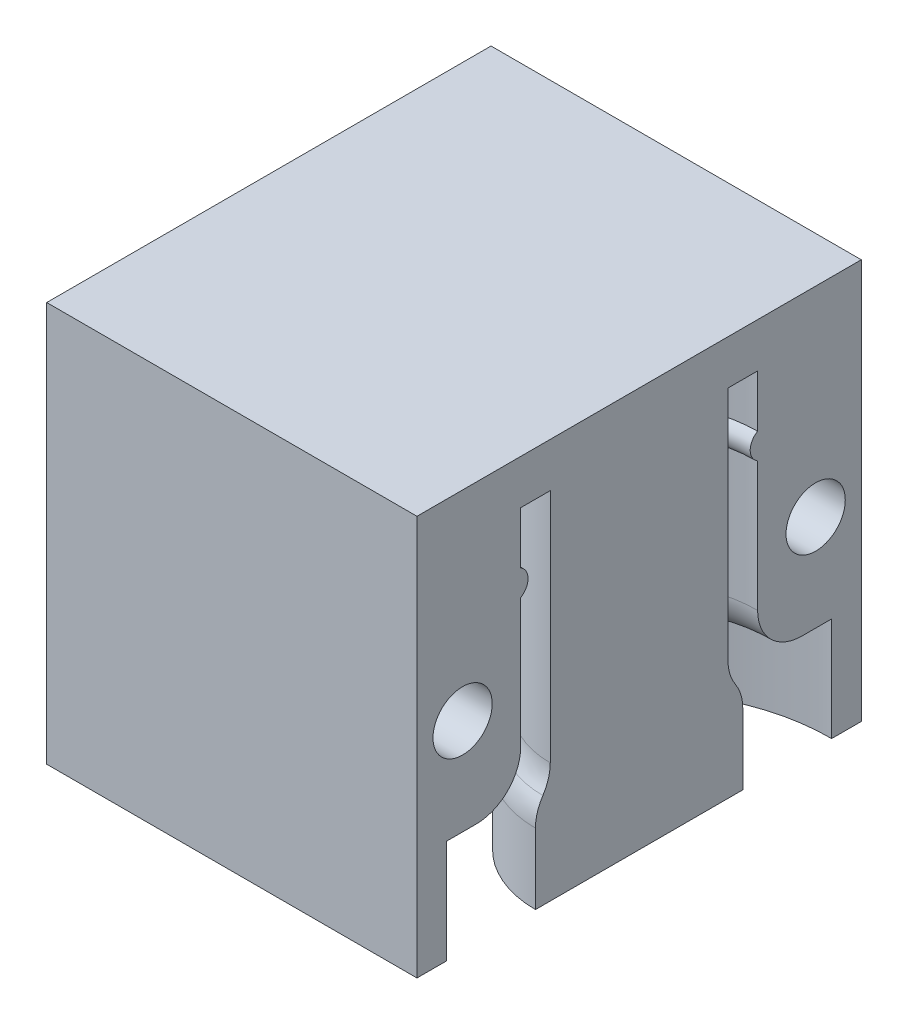
ISO-10303-21;
HEADER;
FILE_DESCRIPTION(('STEP AP214'),'2;1');
FILE_NAME('part.step','',(''),(''),'','','');
FILE_SCHEMA(('AUTOMOTIVE_DESIGN { 1 0 10303 214 1 1 1 1 }'));
ENDSEC;
DATA;
#1=APPLICATION_CONTEXT('core data for automotive mechanical design processes');
#2=APPLICATION_PROTOCOL_DEFINITION('international standard','automotive_design',2000,#1);
#3=PRODUCT_CONTEXT('',#1,'mechanical');
#4=PRODUCT('Part','Part','',(#3));
#5=PRODUCT_RELATED_PRODUCT_CATEGORY('part','',(#4));
#6=PRODUCT_DEFINITION_FORMATION('','',#4);
#7=PRODUCT_DEFINITION_CONTEXT('part definition',#1,'design');
#8=PRODUCT_DEFINITION('design','',#6,#7);
#9=PRODUCT_DEFINITION_SHAPE('','',#8);
#10=(LENGTH_UNIT() NAMED_UNIT(*) SI_UNIT(.MILLI.,.METRE.));
#11=(NAMED_UNIT(*) PLANE_ANGLE_UNIT() SI_UNIT($,.RADIAN.));
#12=(NAMED_UNIT(*) SI_UNIT($,.STERADIAN.) SOLID_ANGLE_UNIT());
#13=UNCERTAINTY_MEASURE_WITH_UNIT(LENGTH_MEASURE(1.E-05),#10,'distance_accuracy_value','');
#14=(GEOMETRIC_REPRESENTATION_CONTEXT(3) GLOBAL_UNCERTAINTY_ASSIGNED_CONTEXT((#13)) GLOBAL_UNIT_ASSIGNED_CONTEXT((#10,
#11,#12)) REPRESENTATION_CONTEXT('',''));
#15=CARTESIAN_POINT('',(0.,0.,0.));
#16=DIRECTION('',(0.,0.,1.));
#17=DIRECTION('',(1.,0.,0.));
#18=AXIS2_PLACEMENT_3D('',#15,#16,#17);
#19=CARTESIAN_POINT('',(0.,0.,0.));
#20=DIRECTION('',(1.,0.,0.));
#21=DIRECTION('',(0.,0.,-1.));
#22=AXIS2_PLACEMENT_3D('',#19,#20,#21);
#23=PLANE('',#22);
#24=CARTESIAN_POINT('',(0.,4.76393202250021,4.));
#25=DIRECTION('',(1.,0.,0.));
#26=DIRECTION('',(0.,0.,-1.));
#27=AXIS2_PLACEMENT_3D('',#24,#25,#26);
#28=CIRCLE('',#27,3.);
#29=CARTESIAN_POINT('',(0.,4.76393202250021,7.));
#30=VERTEX_POINT('',#29);
#31=CARTESIAN_POINT('',(0.,6.42224441767791,6.5));
#32=VERTEX_POINT('',#31);
#33=EDGE_CURVE('E305',#30,#32,#28,.F.);
#34=ORIENTED_EDGE('',*,*,#33,.F.);
#35=DIRECTION('',(0.,-1.,0.));
#36=VECTOR('',#35,1.);
#37=CARTESIAN_POINT('',(0.,7.,7.));
#38=LINE('',#37,#36);
#39=CARTESIAN_POINT('',(0.,0.,7.));
#40=VERTEX_POINT('',#39);
#41=EDGE_CURVE('E292',#30,#40,#38,.T.);
#42=ORIENTED_EDGE('',*,*,#41,.T.);
#43=DIRECTION('',(0.,0.,-1.));
#44=VECTOR('',#43,1.);
#45=CARTESIAN_POINT('',(0.,0.,0.));
#46=LINE('',#45,#44);
#47=CARTESIAN_POINT('',(0.,0.,-7.));
#48=VERTEX_POINT('',#47);
#49=EDGE_CURVE('E213',#40,#48,#46,.T.);
#50=ORIENTED_EDGE('',*,*,#49,.T.);
#51=DIRECTION('',(0.,-1.,0.));
#52=VECTOR('',#51,1.);
#53=CARTESIAN_POINT('',(0.,7.,-7.));
#54=LINE('',#53,#52);
#55=CARTESIAN_POINT('',(0.,4.76393202250021,-7.));
#56=VERTEX_POINT('',#55);
#57=EDGE_CURVE('E297',#48,#56,#54,.F.);
#58=ORIENTED_EDGE('',*,*,#57,.T.);
#59=CARTESIAN_POINT('',(0.,4.76393202250021,-4.));
#60=DIRECTION('',(1.,0.,0.));
#61=DIRECTION('',(0.,0.,-1.));
#62=AXIS2_PLACEMENT_3D('',#59,#60,#61);
#63=CIRCLE('',#62,3.);
#64=CARTESIAN_POINT('',(0.,6.42224441767791,-6.5));
#65=VERTEX_POINT('',#64);
#66=EDGE_CURVE('E296',#65,#56,#63,.F.);
#67=ORIENTED_EDGE('',*,*,#66,.F.);
#68=CARTESIAN_POINT('',(0.,8.08055681285561,-9.));
#69=DIRECTION('',(1.,0.,0.));
#70=DIRECTION('',(0.,0.,-1.));
#71=AXIS2_PLACEMENT_3D('',#68,#69,#70);
#72=CIRCLE('',#71,3.);
#73=CARTESIAN_POINT('',(0.,8.08055681285561,-6.));
#74=VERTEX_POINT('',#73);
#75=EDGE_CURVE('E313',#65,#74,#72,.F.);
#76=ORIENTED_EDGE('',*,*,#75,.T.);
#77=DIRECTION('',(0.,-1.,0.));
#78=VECTOR('',#77,1.);
#79=CARTESIAN_POINT('',(0.,24.,-6.));
#80=LINE('',#79,#78);
#81=CARTESIAN_POINT('',(0.,24.,-6.));
#82=VERTEX_POINT('',#81);
#83=EDGE_CURVE('E321',#74,#82,#80,.F.);
#84=ORIENTED_EDGE('',*,*,#83,.T.);
#85=DIRECTION('',(0.,0.,-1.));
#86=VECTOR('',#85,1.);
#87=CARTESIAN_POINT('',(0.,24.,0.));
#88=LINE('',#87,#86);
#89=CARTESIAN_POINT('',(0.,24.,-8.));
#90=VERTEX_POINT('',#89);
#91=EDGE_CURVE('E326',#82,#90,#88,.T.);
#92=ORIENTED_EDGE('',*,*,#91,.T.);
#93=DIRECTION('',(0.,-1.,0.));
#94=VECTOR('',#93,1.);
#95=CARTESIAN_POINT('',(0.,24.,-8.));
#96=LINE('',#95,#94);
#97=CARTESIAN_POINT('',(0.,20.4748700109732,-8.));
#98=VERTEX_POINT('',#97);
#99=EDGE_CURVE('E334',#98,#90,#96,.F.);
#100=ORIENTED_EDGE('',*,*,#99,.F.);
#101=CARTESIAN_POINT('',(0.,19.6088446071888,-8.5));
#102=DIRECTION('',(1.,0.,0.));
#103=DIRECTION('',(0.,0.,-1.));
#104=AXIS2_PLACEMENT_3D('',#101,#102,#103);
#105=CIRCLE('',#104,1.);
#106=CARTESIAN_POINT('',(0.,18.7428192034043,-8.));
#107=VERTEX_POINT('',#106);
#108=EDGE_CURVE('E363',#107,#98,#105,.F.);
#109=ORIENTED_EDGE('',*,*,#108,.F.);
#110=DIRECTION('',(0.,-1.,0.));
#111=VECTOR('',#110,1.);
#112=CARTESIAN_POINT('',(0.,24.,-8.));
#113=LINE('',#112,#111);
#114=CARTESIAN_POINT('',(0.,10.,-8.));
#115=VERTEX_POINT('',#114);
#116=EDGE_CURVE('E355',#115,#107,#113,.F.);
#117=ORIENTED_EDGE('',*,*,#116,.F.);
#118=CARTESIAN_POINT('',(0.,10.,-11.));
#119=DIRECTION('',(1.,0.,0.));
#120=DIRECTION('',(0.,0.,-1.));
#121=AXIS2_PLACEMENT_3D('',#118,#119,#120);
#122=CIRCLE('',#121,3.);
#123=CARTESIAN_POINT('',(0.,7.,-11.));
#124=VERTEX_POINT('',#123);
#125=EDGE_CURVE('E203',#124,#115,#122,.F.);
#126=ORIENTED_EDGE('',*,*,#125,.F.);
#127=DIRECTION('',(0.,0.,-1.));
#128=VECTOR('',#127,1.);
#129=CARTESIAN_POINT('',(0.,7.,8.37334132896206));
#130=LINE('',#129,#128);
#131=CARTESIAN_POINT('',(0.,7.,-12.9998225615912));
#132=VERTEX_POINT('',#131);
#133=EDGE_CURVE('E217',#124,#132,#130,.T.);
#134=ORIENTED_EDGE('',*,*,#133,.T.);
#135=DIRECTION('',(0.,-1.,0.));
#136=VECTOR('',#135,1.);
#137=CARTESIAN_POINT('',(0.,7.,-12.9998225615912));
#138=LINE('',#137,#136);
#139=CARTESIAN_POINT('',(0.,0.,-12.9998225615912));
#140=VERTEX_POINT('',#139);
#141=EDGE_CURVE('E204',#140,#132,#138,.F.);
#142=ORIENTED_EDGE('',*,*,#141,.F.);
#143=DIRECTION('',(0.,0.,-1.));
#144=VECTOR('',#143,1.);
#145=CARTESIAN_POINT('',(0.,0.,0.));
#146=LINE('',#145,#144);
#147=CARTESIAN_POINT('',(0.,0.,-15.));
#148=VERTEX_POINT('',#147);
#149=EDGE_CURVE('E43',#140,#148,#146,.T.);
#150=ORIENTED_EDGE('',*,*,#149,.T.);
#151=DIRECTION('',(0.,-1.,0.));
#152=VECTOR('',#151,1.);
#153=CARTESIAN_POINT('',(0.,27.,-15.));
#154=LINE('',#153,#152);
#155=CARTESIAN_POINT('',(0.,27.,-15.));
#156=VERTEX_POINT('',#155);
#157=EDGE_CURVE('E366',#156,#148,#154,.T.);
#158=ORIENTED_EDGE('',*,*,#157,.F.);
#159=DIRECTION('',(0.,0.,-1.));
#160=VECTOR('',#159,1.);
#161=CARTESIAN_POINT('',(0.,27.,0.));
#162=LINE('',#161,#160);
#163=CARTESIAN_POINT('',(0.,27.,15.));
#164=VERTEX_POINT('',#163);
#165=EDGE_CURVE('E238',#164,#156,#162,.T.);
#166=ORIENTED_EDGE('',*,*,#165,.F.);
#167=DIRECTION('',(0.,1.,0.));
#168=VECTOR('',#167,1.);
#169=CARTESIAN_POINT('',(0.,27.,15.));
#170=LINE('',#169,#168);
#171=CARTESIAN_POINT('',(0.,0.,15.));
#172=VERTEX_POINT('',#171);
#173=EDGE_CURVE('E211',#172,#164,#170,.T.);
#174=ORIENTED_EDGE('',*,*,#173,.F.);
#175=CARTESIAN_POINT('',(0.,0.,12.9998225615912));
#176=VERTEX_POINT('',#175);
#177=EDGE_CURVE('E186',#172,#176,#146,.T.);
#178=ORIENTED_EDGE('',*,*,#177,.T.);
#179=DIRECTION('',(0.,-1.,0.));
#180=VECTOR('',#179,1.);
#181=CARTESIAN_POINT('',(0.,7.,12.9998225615912));
#182=LINE('',#181,#180);
#183=CARTESIAN_POINT('',(0.,7.,12.9998225615912));
#184=VERTEX_POINT('',#183);
#185=EDGE_CURVE('E195',#184,#176,#182,.T.);
#186=ORIENTED_EDGE('',*,*,#185,.F.);
#187=CARTESIAN_POINT('',(0.,7.,11.));
#188=VERTEX_POINT('',#187);
#189=EDGE_CURVE('E330',#184,#188,#130,.T.);
#190=ORIENTED_EDGE('',*,*,#189,.T.);
#191=CARTESIAN_POINT('',(0.,10.,11.));
#192=DIRECTION('',(1.,0.,0.));
#193=DIRECTION('',(0.,0.,-1.));
#194=AXIS2_PLACEMENT_3D('',#191,#192,#193);
#195=CIRCLE('',#194,3.);
#196=CARTESIAN_POINT('',(0.,10.,8.));
#197=VERTEX_POINT('',#196);
#198=EDGE_CURVE('E347',#197,#188,#195,.F.);
#199=ORIENTED_EDGE('',*,*,#198,.F.);
#200=DIRECTION('',(0.,-1.,0.));
#201=VECTOR('',#200,1.);
#202=CARTESIAN_POINT('',(0.,24.,8.));
#203=LINE('',#202,#201);
#204=CARTESIAN_POINT('',(0.,18.7428192034043,8.));
#205=VERTEX_POINT('',#204);
#206=EDGE_CURVE('E351',#205,#197,#203,.T.);
#207=ORIENTED_EDGE('',*,*,#206,.F.);
#208=CARTESIAN_POINT('',(0.,19.6088446071888,8.5));
#209=DIRECTION('',(1.,0.,0.));
#210=DIRECTION('',(0.,0.,-1.));
#211=AXIS2_PLACEMENT_3D('',#208,#209,#210);
#212=CIRCLE('',#211,1.);
#213=CARTESIAN_POINT('',(0.,20.4748700109732,8.));
#214=VERTEX_POINT('',#213);
#215=EDGE_CURVE('E359',#214,#205,#212,.F.);
#216=ORIENTED_EDGE('',*,*,#215,.F.);
#217=DIRECTION('',(0.,-1.,0.));
#218=VECTOR('',#217,1.);
#219=CARTESIAN_POINT('',(0.,24.,8.));
#220=LINE('',#219,#218);
#221=CARTESIAN_POINT('',(0.,24.,8.));
#222=VERTEX_POINT('',#221);
#223=EDGE_CURVE('E309',#222,#214,#220,.T.);
#224=ORIENTED_EDGE('',*,*,#223,.F.);
#225=CARTESIAN_POINT('',(0.,24.,6.));
#226=VERTEX_POINT('',#225);
#227=EDGE_CURVE('E325',#222,#226,#88,.T.);
#228=ORIENTED_EDGE('',*,*,#227,.T.);
#229=DIRECTION('',(0.,-1.,0.));
#230=VECTOR('',#229,1.);
#231=CARTESIAN_POINT('',(0.,24.,6.));
#232=LINE('',#231,#230);
#233=CARTESIAN_POINT('',(0.,8.08055681285561,6.));
#234=VERTEX_POINT('',#233);
#235=EDGE_CURVE('E317',#226,#234,#232,.T.);
#236=ORIENTED_EDGE('',*,*,#235,.T.);
#237=CARTESIAN_POINT('',(0.,8.08055681285561,9.));
#238=DIRECTION('',(1.,0.,0.));
#239=DIRECTION('',(0.,0.,-1.));
#240=AXIS2_PLACEMENT_3D('',#237,#238,#239);
#241=CIRCLE('',#240,3.);
#242=EDGE_CURVE('E301',#234,#32,#241,.F.);
#243=ORIENTED_EDGE('',*,*,#242,.T.);
#244=EDGE_LOOP('',(#34,#42,#50,#58,#67,#76,#84,#92,#100,#109,#117,#126,#134,#142,#150,#158,#166,
#174,#178,#186,#190,#199,#207,#216,#224,#228,#236,#243));
#245=FACE_BOUND('',#244,.T.);
#246=CARTESIAN_POINT('',(0.,13.5,11.9204128712025));
#247=DIRECTION('',(1.,0.,0.));
#248=DIRECTION('',(0.,0.,-1.));
#249=AXIS2_PLACEMENT_3D('',#246,#247,#248);
#250=CIRCLE('',#249,2.);
#251=CARTESIAN_POINT('',(0.,13.5,9.92041287120254));
#252=VERTEX_POINT('',#251);
#253=EDGE_CURVE('E220',#252,#252,#250,.F.);
#254=ORIENTED_EDGE('',*,*,#253,.T.);
#255=EDGE_LOOP('',(#254));
#256=FACE_BOUND('',#255,.T.);
#257=CARTESIAN_POINT('',(0.,13.5,-11.9204128712025));
#258=DIRECTION('',(1.,0.,0.));
#259=DIRECTION('',(0.,0.,-1.));
#260=AXIS2_PLACEMENT_3D('',#257,#258,#259);
#261=CIRCLE('',#260,2.);
#262=CARTESIAN_POINT('',(0.,13.5,-13.9204128712025));
#263=VERTEX_POINT('',#262);
#264=EDGE_CURVE('E226',#263,#263,#261,.F.);
#265=ORIENTED_EDGE('',*,*,#264,.T.);
#266=EDGE_LOOP('',(#265));
#267=FACE_BOUND('',#266,.T.);
#268=ADVANCED_FACE('F40',(#245,#256,#267),#23,.T.);
#269=CARTESIAN_POINT('',(0.,7.,0.));
#270=DIRECTION('',(0.,-1.,0.));
#271=DIRECTION('',(0.,0.,-1.));
#272=AXIS2_PLACEMENT_3D('',#269,#270,#271);
#273=CYLINDRICAL_SURFACE('',#272,7.);
#274=ORIENTED_EDGE('',*,*,#41,.F.);
#275=CARTESIAN_POINT('',(0.,4.76393202250021,0.));
#276=DIRECTION('',(0.,1.,0.));
#277=DIRECTION('',(0.,0.,1.));
#278=AXIS2_PLACEMENT_3D('',#275,#276,#277);
#279=CIRCLE('',#278,7.);
#280=EDGE_CURVE('E249',#56,#30,#279,.T.);
#281=ORIENTED_EDGE('',*,*,#280,.F.);
#282=ORIENTED_EDGE('',*,*,#57,.F.);
#283=CARTESIAN_POINT('',(0.,0.,0.));
#284=DIRECTION('',(0.,1.,0.));
#285=DIRECTION('',(0.,0.,1.));
#286=AXIS2_PLACEMENT_3D('',#283,#284,#285);
#287=CIRCLE('',#286,7.);
#288=EDGE_CURVE('E272',#48,#40,#287,.T.);
#289=ORIENTED_EDGE('',*,*,#288,.T.);
#290=EDGE_LOOP('',(#274,#281,#282,#289));
#291=FACE_BOUND('',#290,.T.);
#292=ADVANCED_FACE('F459',(#291),#273,.T.);
#293=CARTESIAN_POINT('',(0.,4.76393202250021,0.));
#294=DIRECTION('',(0.,1.,0.));
#295=DIRECTION('',(0.,0.,1.));
#296=AXIS2_PLACEMENT_3D('',#293,#294,#295);
#297=TOROIDAL_SURFACE('',#296,4.,3.);
#298=CARTESIAN_POINT('',(0.,6.42224441767791,0.));
#299=DIRECTION('',(0.,-1.,0.));
#300=DIRECTION('',(0.,0.,-1.));
#301=AXIS2_PLACEMENT_3D('',#298,#299,#300);
#302=CIRCLE('',#301,6.5);
#303=EDGE_CURVE('E259',#65,#32,#302,.F.);
#304=ORIENTED_EDGE('',*,*,#303,.F.);
#305=ORIENTED_EDGE('',*,*,#66,.T.);
#306=ORIENTED_EDGE('',*,*,#280,.T.);
#307=ORIENTED_EDGE('',*,*,#33,.T.);
#308=EDGE_LOOP('',(#304,#305,#306,#307));
#309=FACE_BOUND('',#308,.T.);
#310=ADVANCED_FACE('F455',(#309),#297,.T.);
#311=CARTESIAN_POINT('',(0.,8.08055681285561,0.));
#312=DIRECTION('',(0.,-1.,0.));
#313=DIRECTION('',(0.,0.,-1.));
#314=AXIS2_PLACEMENT_3D('',#311,#312,#313);
#315=TOROIDAL_SURFACE('',#314,9.,3.);
#316=ORIENTED_EDGE('',*,*,#242,.F.);
#317=CARTESIAN_POINT('',(0.,8.08055681285561,0.));
#318=DIRECTION('',(0.,-1.,0.));
#319=DIRECTION('',(0.,0.,-1.));
#320=AXIS2_PLACEMENT_3D('',#317,#318,#319);
#321=CIRCLE('',#320,6.);
#322=EDGE_CURVE('E262',#234,#74,#321,.T.);
#323=ORIENTED_EDGE('',*,*,#322,.T.);
#324=ORIENTED_EDGE('',*,*,#75,.F.);
#325=ORIENTED_EDGE('',*,*,#303,.T.);
#326=EDGE_LOOP('',(#316,#323,#324,#325));
#327=FACE_BOUND('',#326,.T.);
#328=ADVANCED_FACE('F451',(#327),#315,.F.);
#329=CARTESIAN_POINT('',(0.,24.,0.));
#330=DIRECTION('',(0.,-1.,0.));
#331=DIRECTION('',(0.,0.,-1.));
#332=AXIS2_PLACEMENT_3D('',#329,#330,#331);
#333=CYLINDRICAL_SURFACE('',#332,6.);
#334=ORIENTED_EDGE('',*,*,#235,.F.);
#335=CARTESIAN_POINT('',(0.,24.,0.));
#336=DIRECTION('',(0.,1.,0.));
#337=DIRECTION('',(0.,0.,1.));
#338=AXIS2_PLACEMENT_3D('',#335,#336,#337);
#339=CIRCLE('',#338,6.);
#340=EDGE_CURVE('E234',#82,#226,#339,.T.);
#341=ORIENTED_EDGE('',*,*,#340,.F.);
#342=ORIENTED_EDGE('',*,*,#83,.F.);
#343=ORIENTED_EDGE('',*,*,#322,.F.);
#344=EDGE_LOOP('',(#334,#341,#342,#343));
#345=FACE_BOUND('',#344,.T.);
#346=ADVANCED_FACE('F447',(#345),#333,.T.);
#347=CARTESIAN_POINT('',(0.,24.,0.));
#348=DIRECTION('',(0.,1.,0.));
#349=DIRECTION('',(0.,0.,1.));
#350=AXIS2_PLACEMENT_3D('',#347,#348,#349);
#351=PLANE('',#350);
#352=ORIENTED_EDGE('',*,*,#227,.F.);
#353=CARTESIAN_POINT('',(0.,24.,0.));
#354=DIRECTION('',(0.,1.,0.));
#355=DIRECTION('',(0.,0.,1.));
#356=AXIS2_PLACEMENT_3D('',#353,#354,#355);
#357=CIRCLE('',#356,8.);
#358=EDGE_CURVE('E237',#90,#222,#357,.T.);
#359=ORIENTED_EDGE('',*,*,#358,.F.);
#360=ORIENTED_EDGE('',*,*,#91,.F.);
#361=ORIENTED_EDGE('',*,*,#340,.T.);
#362=EDGE_LOOP('',(#352,#359,#360,#361));
#363=FACE_BOUND('',#362,.T.);
#364=ADVANCED_FACE('F443',(#363),#351,.F.);
#365=CARTESIAN_POINT('',(0.,24.,0.));
#366=DIRECTION('',(0.,-1.,0.));
#367=DIRECTION('',(0.,0.,-1.));
#368=AXIS2_PLACEMENT_3D('',#365,#366,#367);
#369=CYLINDRICAL_SURFACE('',#368,8.);
#370=ORIENTED_EDGE('',*,*,#358,.T.);
#371=ORIENTED_EDGE('',*,*,#223,.T.);
#372=CARTESIAN_POINT('',(0.,20.4748700109732,0.));
#373=DIRECTION('',(0.,-1.,0.));
#374=DIRECTION('',(0.,0.,-1.));
#375=AXIS2_PLACEMENT_3D('',#372,#373,#374);
#376=CIRCLE('',#375,8.);
#377=EDGE_CURVE('E265',#98,#214,#376,.F.);
#378=ORIENTED_EDGE('',*,*,#377,.F.);
#379=ORIENTED_EDGE('',*,*,#99,.T.);
#380=EDGE_LOOP('',(#370,#371,#378,#379));
#381=FACE_BOUND('',#380,.T.);
#382=ADVANCED_FACE('F465',(#381),#369,.F.);
#383=CARTESIAN_POINT('',(-0.0679217722446071,7.,0.));
#384=DIRECTION('',(0.,-1.,0.));
#385=DIRECTION('',(0.,0.,-1.));
#386=AXIS2_PLACEMENT_3D('',#383,#384,#385);
#387=CYLINDRICAL_SURFACE('',#386,13.);
#388=CARTESIAN_POINT('',(-0.0679217722446071,0.,0.));
#389=DIRECTION('',(0.,1.,0.));
#390=DIRECTION('',(0.,0.,1.));
#391=AXIS2_PLACEMENT_3D('',#388,#389,#390);
#392=CIRCLE('',#391,13.);
#393=CARTESIAN_POINT('',(-8.97881406538982,0.,-9.46551628491363));
#394=VERTEX_POINT('',#393);
#395=EDGE_CURVE('E192',#140,#394,#392,.T.);
#396=ORIENTED_EDGE('',*,*,#395,.F.);
#397=ORIENTED_EDGE('',*,*,#141,.T.);
#398=CARTESIAN_POINT('',(-0.0679217722446071,7.,0.));
#399=DIRECTION('',(0.,1.,0.));
#400=DIRECTION('',(0.,0.,1.));
#401=AXIS2_PLACEMENT_3D('',#398,#399,#400);
#402=CIRCLE('',#401,13.);
#403=CARTESIAN_POINT('',(-8.97881406538982,7.,-9.46551628491363));
#404=VERTEX_POINT('',#403);
#405=EDGE_CURVE('E244',#132,#404,#402,.T.);
#406=ORIENTED_EDGE('',*,*,#405,.T.);
#407=DIRECTION('',(0.,-1.,0.));
#408=VECTOR('',#407,1.);
#409=CARTESIAN_POINT('',(-8.97881406538982,7.,-9.46551628491363));
#410=LINE('',#409,#408);
#411=EDGE_CURVE('E422',#404,#394,#410,.T.);
#412=ORIENTED_EDGE('',*,*,#411,.T.);
#413=EDGE_LOOP('',(#396,#397,#406,#412));
#414=FACE_BOUND('',#413,.T.);
#415=ADVANCED_FACE('F477',(#414),#387,.F.);
#416=CARTESIAN_POINT('',(-0.0679217722446071,7.,0.));
#417=DIRECTION('',(0.,-1.,0.));
#418=DIRECTION('',(0.,0.,-1.));
#419=AXIS2_PLACEMENT_3D('',#416,#417,#418);
#420=CYLINDRICAL_SURFACE('',#419,13.);
#421=CARTESIAN_POINT('',(-0.0679217722446071,7.,0.));
#422=DIRECTION('',(0.,1.,0.));
#423=DIRECTION('',(0.,0.,1.));
#424=AXIS2_PLACEMENT_3D('',#421,#422,#423);
#425=CIRCLE('',#424,13.);
#426=CARTESIAN_POINT('',(-8.97881406538982,7.,9.46551628491364));
#427=VERTEX_POINT('',#426);
#428=EDGE_CURVE('E198',#427,#184,#425,.T.);
#429=ORIENTED_EDGE('',*,*,#428,.T.);
#430=ORIENTED_EDGE('',*,*,#185,.T.);
#431=CARTESIAN_POINT('',(-0.0679217722446071,0.,0.));
#432=DIRECTION('',(0.,1.,0.));
#433=DIRECTION('',(0.,0.,1.));
#434=AXIS2_PLACEMENT_3D('',#431,#432,#433);
#435=CIRCLE('',#434,13.);
#436=CARTESIAN_POINT('',(-8.97881406538982,0.,9.46551628491364));
#437=VERTEX_POINT('',#436);
#438=EDGE_CURVE('E182',#437,#176,#435,.T.);
#439=ORIENTED_EDGE('',*,*,#438,.F.);
#440=DIRECTION('',(0.,-1.,0.));
#441=VECTOR('',#440,1.);
#442=CARTESIAN_POINT('',(-8.97881406538982,7.,9.46551628491364));
#443=LINE('',#442,#441);
#444=EDGE_CURVE('E253',#427,#437,#443,.T.);
#445=ORIENTED_EDGE('',*,*,#444,.F.);
#446=EDGE_LOOP('',(#429,#430,#439,#445));
#447=FACE_BOUND('',#446,.T.);
#448=ADVANCED_FACE('F196',(#447),#420,.F.);
#449=CARTESIAN_POINT('',(-15.6666732992892,7.,8.37334132896206));
#450=DIRECTION('',(0.,1.,0.));
#451=DIRECTION('',(0.,0.,1.));
#452=AXIS2_PLACEMENT_3D('',#449,#450,#451);
#453=PLANE('',#452);
#454=CARTESIAN_POINT('',(-15.5,7.,0.));
#455=DIRECTION('',(0.,1.,0.));
#456=DIRECTION('',(0.,0.,1.));
#457=AXIS2_PLACEMENT_3D('',#454,#455,#456);
#458=CIRCLE('',#457,2.75);
#459=CARTESIAN_POINT('',(-15.5,7.,2.75));
#460=VERTEX_POINT('',#459);
#461=EDGE_CURVE('E241',#460,#460,#458,.T.);
#462=ORIENTED_EDGE('',*,*,#461,.T.);
#463=EDGE_LOOP('',(#462));
#464=FACE_BOUND('',#463,.T.);
#465=ORIENTED_EDGE('',*,*,#189,.F.);
#466=ORIENTED_EDGE('',*,*,#428,.F.);
#467=CARTESIAN_POINT('',(-15.8333465985785,7.,16.7466826579241));
#468=DIRECTION('',(0.,-1.,0.));
#469=DIRECTION('',(0.,0.,1.));
#470=AXIS2_PLACEMENT_3D('',#467,#468,#469);
#471=CIRCLE('',#470,10.);
#472=CARTESIAN_POINT('',(-15.6343337039048,7.,6.74866316065599));
#473=VERTEX_POINT('',#472);
#474=EDGE_CURVE('E245',#473,#427,#471,.T.);
#475=ORIENTED_EDGE('',*,*,#474,.F.);
#476=CARTESIAN_POINT('',(-15.5,7.,0.));
#477=DIRECTION('',(0.,1.,0.));
#478=DIRECTION('',(0.,0.,1.));
#479=AXIS2_PLACEMENT_3D('',#476,#477,#478);
#480=CIRCLE('',#479,6.75);
#481=CARTESIAN_POINT('',(-15.6343337039047,7.,-6.74866316065598));
#482=VERTEX_POINT('',#481);
#483=EDGE_CURVE('E405',#482,#473,#480,.T.);
#484=ORIENTED_EDGE('',*,*,#483,.F.);
#485=CARTESIAN_POINT('',(-15.8333465985785,7.,-16.7466826579241));
#486=DIRECTION('',(0.,-1.,0.));
#487=DIRECTION('',(0.,0.,-1.));
#488=AXIS2_PLACEMENT_3D('',#485,#486,#487);
#489=CIRCLE('',#488,10.);
#490=EDGE_CURVE('E248',#404,#482,#489,.T.);
#491=ORIENTED_EDGE('',*,*,#490,.F.);
#492=ORIENTED_EDGE('',*,*,#405,.F.);
#493=ORIENTED_EDGE('',*,*,#133,.F.);
#494=CARTESIAN_POINT('',(0.,7.,0.));
#495=DIRECTION('',(0.,1.,0.));
#496=DIRECTION('',(0.,0.,1.));
#497=AXIS2_PLACEMENT_3D('',#494,#495,#496);
#498=CIRCLE('',#497,11.);
#499=EDGE_CURVE('E256',#188,#124,#498,.F.);
#500=ORIENTED_EDGE('',*,*,#499,.F.);
#501=EDGE_LOOP('',(#465,#466,#475,#484,#491,#492,#493,#500));
#502=FACE_BOUND('',#501,.T.);
#503=ADVANCED_FACE('F431',(#464,#502),#453,.F.);
#504=CARTESIAN_POINT('',(0.,10.,0.));
#505=DIRECTION('',(0.,1.,0.));
#506=DIRECTION('',(0.,0.,1.));
#507=AXIS2_PLACEMENT_3D('',#504,#505,#506);
#508=TOROIDAL_SURFACE('',#507,11.,3.);
#509=ORIENTED_EDGE('',*,*,#499,.T.);
#510=ORIENTED_EDGE('',*,*,#125,.T.);
#511=CARTESIAN_POINT('',(0.,10.,0.));
#512=DIRECTION('',(0.,1.,0.));
#513=DIRECTION('',(0.,0.,1.));
#514=AXIS2_PLACEMENT_3D('',#511,#512,#513);
#515=CIRCLE('',#514,8.);
#516=EDGE_CURVE('E252',#115,#197,#515,.T.);
#517=ORIENTED_EDGE('',*,*,#516,.T.);
#518=ORIENTED_EDGE('',*,*,#198,.T.);
#519=EDGE_LOOP('',(#509,#510,#517,#518));
#520=FACE_BOUND('',#519,.T.);
#521=ADVANCED_FACE('F474',(#520),#508,.T.);
#522=CARTESIAN_POINT('',(0.,18.7428192034043,0.));
#523=DIRECTION('',(0.,1.,0.));
#524=DIRECTION('',(0.,0.,1.));
#525=AXIS2_PLACEMENT_3D('',#522,#523,#524);
#526=CIRCLE('',#525,8.);
#527=EDGE_CURVE('E268',#205,#107,#526,.F.);
#528=ORIENTED_EDGE('',*,*,#527,.F.);
#529=ORIENTED_EDGE('',*,*,#206,.T.);
#530=ORIENTED_EDGE('',*,*,#516,.F.);
#531=ORIENTED_EDGE('',*,*,#116,.T.);
#532=EDGE_LOOP('',(#528,#529,#530,#531));
#533=FACE_BOUND('',#532,.T.);
#534=ADVANCED_FACE('F471',(#533),#369,.F.);
#535=CARTESIAN_POINT('',(0.,19.6088446071888,0.));
#536=DIRECTION('',(0.,-1.,0.));
#537=DIRECTION('',(0.,0.,-1.));
#538=AXIS2_PLACEMENT_3D('',#535,#536,#537);
#539=TOROIDAL_SURFACE('',#538,8.5,1.);
#540=ORIENTED_EDGE('',*,*,#377,.T.);
#541=ORIENTED_EDGE('',*,*,#215,.T.);
#542=ORIENTED_EDGE('',*,*,#527,.T.);
#543=ORIENTED_EDGE('',*,*,#108,.T.);
#544=EDGE_LOOP('',(#540,#541,#542,#543));
#545=FACE_BOUND('',#544,.T.);
#546=ADVANCED_FACE('F467',(#545),#539,.T.);
#547=CARTESIAN_POINT('',(0.,0.,0.));
#548=DIRECTION('',(0.,1.,0.));
#549=DIRECTION('',(0.,0.,1.));
#550=AXIS2_PLACEMENT_3D('',#547,#548,#549);
#551=PLANE('',#550);
#552=ORIENTED_EDGE('',*,*,#49,.F.);
#553=ORIENTED_EDGE('',*,*,#288,.F.);
#554=EDGE_LOOP('',(#552,#553));
#555=FACE_BOUND('',#554,.T.);
#556=ADVANCED_FACE('F461',(#555),#551,.F.);
#557=CARTESIAN_POINT('',(-25.,27.,-15.));
#558=DIRECTION('',(0.,0.,-1.));
#559=DIRECTION('',(-1.,0.,0.));
#560=AXIS2_PLACEMENT_3D('',#557,#558,#559);
#561=PLANE('',#560);
#562=DIRECTION('',(1.,0.,0.));
#563=VECTOR('',#562,1.);
#564=CARTESIAN_POINT('',(-25.,27.,-15.));
#565=LINE('',#564,#563);
#566=CARTESIAN_POINT('',(-25.,27.,-15.));
#567=VERTEX_POINT('',#566);
#568=EDGE_CURVE('E278',#567,#156,#565,.T.);
#569=ORIENTED_EDGE('',*,*,#568,.T.);
#570=ORIENTED_EDGE('',*,*,#157,.T.);
#571=DIRECTION('',(1.,0.,0.));
#572=VECTOR('',#571,1.);
#573=CARTESIAN_POINT('',(-25.,0.,-15.));
#574=LINE('',#573,#572);
#575=CARTESIAN_POINT('',(-25.,0.,-15.));
#576=VERTEX_POINT('',#575);
#577=EDGE_CURVE('E286',#576,#148,#574,.T.);
#578=ORIENTED_EDGE('',*,*,#577,.F.);
#579=DIRECTION('',(0.,-1.,0.));
#580=VECTOR('',#579,1.);
#581=CARTESIAN_POINT('',(-25.,27.,-15.));
#582=LINE('',#581,#580);
#583=EDGE_CURVE('E70',#567,#576,#582,.T.);
#584=ORIENTED_EDGE('',*,*,#583,.F.);
#585=EDGE_LOOP('',(#569,#570,#578,#584));
#586=FACE_BOUND('',#585,.T.);
#587=ADVANCED_FACE('F378',(#586),#561,.T.);
#588=CARTESIAN_POINT('',(-25.,27.,15.));
#589=DIRECTION('',(0.,0.,1.));
#590=DIRECTION('',(1.,0.,0.));
#591=AXIS2_PLACEMENT_3D('',#588,#589,#590);
#592=PLANE('',#591);
#593=DIRECTION('',(-1.,0.,0.));
#594=VECTOR('',#593,1.);
#595=CARTESIAN_POINT('',(-25.,0.,15.));
#596=LINE('',#595,#594);
#597=CARTESIAN_POINT('',(-25.,0.,15.));
#598=VERTEX_POINT('',#597);
#599=EDGE_CURVE('E59',#172,#598,#596,.T.);
#600=ORIENTED_EDGE('',*,*,#599,.F.);
#601=ORIENTED_EDGE('',*,*,#173,.T.);
#602=DIRECTION('',(-1.,0.,0.));
#603=VECTOR('',#602,1.);
#604=CARTESIAN_POINT('',(-25.,27.,15.));
#605=LINE('',#604,#603);
#606=CARTESIAN_POINT('',(-25.,27.,15.));
#607=VERTEX_POINT('',#606);
#608=EDGE_CURVE('E283',#164,#607,#605,.T.);
#609=ORIENTED_EDGE('',*,*,#608,.T.);
#610=DIRECTION('',(0.,-1.,0.));
#611=VECTOR('',#610,1.);
#612=CARTESIAN_POINT('',(-25.,27.,15.));
#613=LINE('',#612,#611);
#614=EDGE_CURVE('E282',#607,#598,#613,.T.);
#615=ORIENTED_EDGE('',*,*,#614,.T.);
#616=EDGE_LOOP('',(#600,#601,#609,#615));
#617=FACE_BOUND('',#616,.T.);
#618=ADVANCED_FACE('F517',(#617),#592,.T.);
#619=CARTESIAN_POINT('',(0.,27.,0.));
#620=DIRECTION('',(0.,1.,0.));
#621=DIRECTION('',(0.,0.,1.));
#622=AXIS2_PLACEMENT_3D('',#619,#620,#621);
#623=PLANE('',#622);
#624=ORIENTED_EDGE('',*,*,#608,.F.);
#625=ORIENTED_EDGE('',*,*,#165,.T.);
#626=ORIENTED_EDGE('',*,*,#568,.F.);
#627=DIRECTION('',(0.,0.,-1.));
#628=VECTOR('',#627,1.);
#629=CARTESIAN_POINT('',(-25.,27.,-15.));
#630=LINE('',#629,#628);
#631=EDGE_CURVE('E281',#607,#567,#630,.T.);
#632=ORIENTED_EDGE('',*,*,#631,.F.);
#633=EDGE_LOOP('',(#624,#625,#626,#632));
#634=FACE_BOUND('',#633,.T.);
#635=ADVANCED_FACE('F376',(#634),#623,.T.);
#636=ORIENTED_EDGE('',*,*,#177,.F.);
#637=ORIENTED_EDGE('',*,*,#599,.T.);
#638=DIRECTION('',(0.,0.,-1.));
#639=VECTOR('',#638,1.);
#640=CARTESIAN_POINT('',(-25.,0.,-15.));
#641=LINE('',#640,#639);
#642=EDGE_CURVE('E289',#598,#576,#641,.T.);
#643=ORIENTED_EDGE('',*,*,#642,.T.);
#644=ORIENTED_EDGE('',*,*,#577,.T.);
#645=ORIENTED_EDGE('',*,*,#149,.F.);
#646=ORIENTED_EDGE('',*,*,#395,.T.);
#647=CARTESIAN_POINT('',(-15.8333465985785,0.,-16.7466826579241));
#648=DIRECTION('',(0.,-1.,0.));
#649=DIRECTION('',(0.,0.,-1.));
#650=AXIS2_PLACEMENT_3D('',#647,#648,#649);
#651=CIRCLE('',#650,10.);
#652=CARTESIAN_POINT('',(-15.6343337039047,0.,-6.74866316065598));
#653=VERTEX_POINT('',#652);
#654=EDGE_CURVE('E276',#394,#653,#651,.T.);
#655=ORIENTED_EDGE('',*,*,#654,.T.);
#656=CARTESIAN_POINT('',(-15.5,0.,0.));
#657=DIRECTION('',(0.,1.,0.));
#658=DIRECTION('',(0.,0.,1.));
#659=AXIS2_PLACEMENT_3D('',#656,#657,#658);
#660=CIRCLE('',#659,6.75);
#661=CARTESIAN_POINT('',(-15.6343337039048,0.,6.74866316065599));
#662=VERTEX_POINT('',#661);
#663=EDGE_CURVE('E79',#653,#662,#660,.T.);
#664=ORIENTED_EDGE('',*,*,#663,.T.);
#665=CARTESIAN_POINT('',(-15.8333465985785,0.,16.7466826579241));
#666=DIRECTION('',(0.,-1.,0.));
#667=DIRECTION('',(0.,0.,1.));
#668=AXIS2_PLACEMENT_3D('',#665,#666,#667);
#669=CIRCLE('',#668,10.);
#670=EDGE_CURVE('E188',#662,#437,#669,.T.);
#671=ORIENTED_EDGE('',*,*,#670,.T.);
#672=ORIENTED_EDGE('',*,*,#438,.T.);
#673=EDGE_LOOP('',(#636,#637,#643,#644,#645,#646,#655,#664,#671,#672));
#674=FACE_BOUND('',#673,.T.);
#675=ADVANCED_FACE('F184',(#674),#551,.F.);
#676=CARTESIAN_POINT('',(32.,13.5,11.9204128712025));
#677=DIRECTION('',(-1.,0.,0.));
#678=DIRECTION('',(0.,0.,1.));
#679=AXIS2_PLACEMENT_3D('',#676,#677,#678);
#680=CYLINDRICAL_SURFACE('',#679,2.);
#681=CARTESIAN_POINT('',(-25.,13.5,11.9204128712025));
#682=DIRECTION('',(-1.,0.,0.));
#683=DIRECTION('',(0.,0.,-1.));
#684=AXIS2_PLACEMENT_3D('',#681,#682,#683);
#685=CIRCLE('',#684,2.);
#686=CARTESIAN_POINT('',(-25.,13.5,9.92041287120253));
#687=VERTEX_POINT('',#686);
#688=EDGE_CURVE('E12',#687,#687,#685,.T.);
#689=ORIENTED_EDGE('',*,*,#688,.T.);
#690=EDGE_LOOP('',(#689));
#691=FACE_BOUND('',#690,.T.);
#692=ORIENTED_EDGE('',*,*,#253,.F.);
#693=EDGE_LOOP('',(#692));
#694=FACE_BOUND('',#693,.T.);
#695=ADVANCED_FACE('F491',(#691,#694),#680,.F.);
#696=CARTESIAN_POINT('',(32.,13.5,-11.9204128712025));
#697=DIRECTION('',(-1.,0.,0.));
#698=DIRECTION('',(0.,0.,1.));
#699=AXIS2_PLACEMENT_3D('',#696,#697,#698);
#700=CYLINDRICAL_SURFACE('',#699,2.);
#701=CARTESIAN_POINT('',(-25.,13.5,-11.9204128712025));
#702=DIRECTION('',(-1.,0.,0.));
#703=DIRECTION('',(0.,0.,1.));
#704=AXIS2_PLACEMENT_3D('',#701,#702,#703);
#705=CIRCLE('',#704,2.);
#706=CARTESIAN_POINT('',(-25.,13.5,-9.92041287120254));
#707=VERTEX_POINT('',#706);
#708=EDGE_CURVE('E50',#707,#707,#705,.T.);
#709=ORIENTED_EDGE('',*,*,#708,.T.);
#710=EDGE_LOOP('',(#709));
#711=FACE_BOUND('',#710,.T.);
#712=ORIENTED_EDGE('',*,*,#264,.F.);
#713=EDGE_LOOP('',(#712));
#714=FACE_BOUND('',#713,.T.);
#715=ADVANCED_FACE('F484',(#711,#714),#700,.F.);
#716=CARTESIAN_POINT('',(-15.5,7.,0.));
#717=DIRECTION('',(0.,-1.,0.));
#718=DIRECTION('',(0.,0.,-1.));
#719=AXIS2_PLACEMENT_3D('',#716,#717,#718);
#720=CYLINDRICAL_SURFACE('',#719,6.75);
#721=ORIENTED_EDGE('',*,*,#663,.F.);
#722=DIRECTION('',(0.,-1.,0.));
#723=VECTOR('',#722,1.);
#724=CARTESIAN_POINT('',(-15.6343337039047,7.,-6.74866316065598));
#725=LINE('',#724,#723);
#726=EDGE_CURVE('E419',#482,#653,#725,.T.);
#727=ORIENTED_EDGE('',*,*,#726,.F.);
#728=ORIENTED_EDGE('',*,*,#483,.T.);
#729=DIRECTION('',(0.,-1.,0.));
#730=VECTOR('',#729,1.);
#731=CARTESIAN_POINT('',(-15.6343337039048,7.,6.74866316065599));
#732=LINE('',#731,#730);
#733=EDGE_CURVE('E409',#473,#662,#732,.T.);
#734=ORIENTED_EDGE('',*,*,#733,.T.);
#735=EDGE_LOOP('',(#721,#727,#728,#734));
#736=FACE_BOUND('',#735,.T.);
#737=ADVANCED_FACE('F482',(#736),#720,.F.);
#738=CARTESIAN_POINT('',(-15.8333465985785,7.,-16.7466826579241));
#739=DIRECTION('',(0.,-1.,0.));
#740=DIRECTION('',(0.,0.,-1.));
#741=AXIS2_PLACEMENT_3D('',#738,#739,#740);
#742=CYLINDRICAL_SURFACE('',#741,10.);
#743=ORIENTED_EDGE('',*,*,#654,.F.);
#744=ORIENTED_EDGE('',*,*,#411,.F.);
#745=ORIENTED_EDGE('',*,*,#490,.T.);
#746=ORIENTED_EDGE('',*,*,#726,.T.);
#747=EDGE_LOOP('',(#743,#744,#745,#746));
#748=FACE_BOUND('',#747,.T.);
#749=ADVANCED_FACE('F481',(#748),#742,.T.);
#750=CARTESIAN_POINT('',(-15.8333465985785,7.,16.7466826579241));
#751=DIRECTION('',(0.,-1.,0.));
#752=DIRECTION('',(0.,0.,-1.));
#753=AXIS2_PLACEMENT_3D('',#750,#751,#752);
#754=CYLINDRICAL_SURFACE('',#753,10.);
#755=ORIENTED_EDGE('',*,*,#670,.F.);
#756=ORIENTED_EDGE('',*,*,#733,.F.);
#757=ORIENTED_EDGE('',*,*,#474,.T.);
#758=ORIENTED_EDGE('',*,*,#444,.T.);
#759=EDGE_LOOP('',(#755,#756,#757,#758));
#760=FACE_BOUND('',#759,.T.);
#761=ADVANCED_FACE('F428',(#760),#754,.T.);
#762=CARTESIAN_POINT('',(-15.5,7.,0.));
#763=DIRECTION('',(0.,-1.,0.));
#764=DIRECTION('',(0.,0.,-1.));
#765=AXIS2_PLACEMENT_3D('',#762,#763,#764);
#766=CYLINDRICAL_SURFACE('',#765,2.75);
#767=ORIENTED_EDGE('',*,*,#461,.F.);
#768=EDGE_LOOP('',(#767));
#769=FACE_BOUND('',#768,.T.);
#770=CARTESIAN_POINT('',(-15.5,0.,0.));
#771=DIRECTION('',(0.,1.,0.));
#772=DIRECTION('',(0.,0.,1.));
#773=AXIS2_PLACEMENT_3D('',#770,#771,#772);
#774=CIRCLE('',#773,2.75);
#775=CARTESIAN_POINT('',(-15.5,0.,2.75));
#776=VERTEX_POINT('',#775);
#777=EDGE_CURVE('E271',#776,#776,#774,.T.);
#778=ORIENTED_EDGE('',*,*,#777,.T.);
#779=EDGE_LOOP('',(#778));
#780=FACE_BOUND('',#779,.T.);
#781=ADVANCED_FACE('F645',(#769,#780),#766,.T.);
#782=ORIENTED_EDGE('',*,*,#777,.F.);
#783=EDGE_LOOP('',(#782));
#784=FACE_BOUND('',#783,.T.);
#785=ADVANCED_FACE('F502',(#784),#551,.F.);
#786=CARTESIAN_POINT('',(-25.,27.,-15.));
#787=DIRECTION('',(-1.,0.,0.));
#788=DIRECTION('',(0.,0.,1.));
#789=AXIS2_PLACEMENT_3D('',#786,#787,#788);
#790=PLANE('',#789);
#791=ORIENTED_EDGE('',*,*,#708,.F.);
#792=EDGE_LOOP('',(#791));
#793=FACE_BOUND('',#792,.T.);
#794=ORIENTED_EDGE('',*,*,#688,.F.);
#795=EDGE_LOOP('',(#794));
#796=FACE_BOUND('',#795,.T.);
#797=ORIENTED_EDGE('',*,*,#642,.F.);
#798=ORIENTED_EDGE('',*,*,#614,.F.);
#799=ORIENTED_EDGE('',*,*,#631,.T.);
#800=ORIENTED_EDGE('',*,*,#583,.T.);
#801=EDGE_LOOP('',(#797,#798,#799,#800));
#802=FACE_BOUND('',#801,.T.);
#803=ADVANCED_FACE('F388',(#793,#796,#802),#790,.T.);
#804=CLOSED_SHELL('',(#268,#292,#310,#328,#346,#364,#382,#415,#448,#503,#521,#534,#546,#556,
#587,#618,#635,#675,#695,#715,#737,#749,#761,#781,#785,#803));
#805=MANIFOLD_SOLID_BREP('B2',#804);
#806=ADVANCED_BREP_SHAPE_REPRESENTATION('',(#18,#805),#14);
#807=SHAPE_DEFINITION_REPRESENTATION(#9,#806);
ENDSEC;
END-ISO-10303-21;
